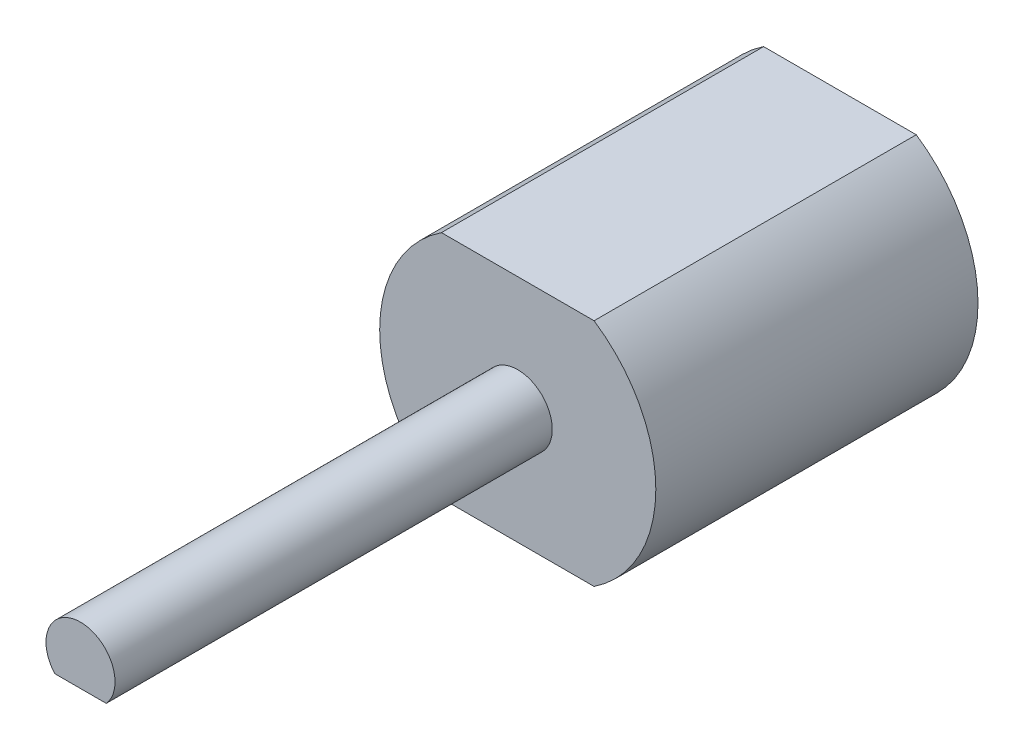
ISO-10303-21;
HEADER;
FILE_DESCRIPTION(('STEP AP214'),'2;1');
FILE_NAME('part.step','',(''),(''),'','','');
FILE_SCHEMA(('AUTOMOTIVE_DESIGN { 1 0 10303 214 1 1 1 1 }'));
ENDSEC;
DATA;
#1=APPLICATION_CONTEXT('core data for automotive mechanical design processes');
#2=APPLICATION_PROTOCOL_DEFINITION('international standard','automotive_design',2000,#1);
#3=PRODUCT_CONTEXT('',#1,'mechanical');
#4=PRODUCT('Part','Part','',(#3));
#5=PRODUCT_RELATED_PRODUCT_CATEGORY('part','',(#4));
#6=PRODUCT_DEFINITION_FORMATION('','',#4);
#7=PRODUCT_DEFINITION_CONTEXT('part definition',#1,'design');
#8=PRODUCT_DEFINITION('design','',#6,#7);
#9=PRODUCT_DEFINITION_SHAPE('','',#8);
#10=(LENGTH_UNIT() NAMED_UNIT(*) SI_UNIT(.MILLI.,.METRE.));
#11=(NAMED_UNIT(*) PLANE_ANGLE_UNIT() SI_UNIT($,.RADIAN.));
#12=(NAMED_UNIT(*) SI_UNIT($,.STERADIAN.) SOLID_ANGLE_UNIT());
#13=UNCERTAINTY_MEASURE_WITH_UNIT(LENGTH_MEASURE(1.E-05),#10,'distance_accuracy_value','');
#14=(GEOMETRIC_REPRESENTATION_CONTEXT(3) GLOBAL_UNCERTAINTY_ASSIGNED_CONTEXT((#13)) GLOBAL_UNIT_ASSIGNED_CONTEXT((#10,
#11,#12)) REPRESENTATION_CONTEXT('',''));
#15=CARTESIAN_POINT('',(0.,0.,0.));
#16=DIRECTION('',(0.,0.,1.));
#17=DIRECTION('',(1.,0.,0.));
#18=AXIS2_PLACEMENT_3D('',#15,#16,#17);
#19=CARTESIAN_POINT('',(0.,0.,25.));
#20=DIRECTION('',(0.,0.,1.));
#21=DIRECTION('',(1.,0.,0.));
#22=AXIS2_PLACEMENT_3D('',#19,#20,#21);
#23=PLANE('',#22);
#24=CARTESIAN_POINT('',(0.,0.,25.));
#25=DIRECTION('',(0.,0.,-1.));
#26=DIRECTION('',(-1.,0.,0.));
#27=AXIS2_PLACEMENT_3D('',#24,#25,#26);
#28=CIRCLE('',#27,1.5);
#29=CARTESIAN_POINT('',(-1.11803398874989,-1.,25.));
#30=VERTEX_POINT('',#29);
#31=CARTESIAN_POINT('',(1.11803398874989,-1.,25.));
#32=VERTEX_POINT('',#31);
#33=EDGE_CURVE('E23',#30,#32,#28,.F.);
#34=ORIENTED_EDGE('',*,*,#33,.T.);
#35=DIRECTION('',(1.,0.,0.));
#36=VECTOR('',#35,1.);
#37=CARTESIAN_POINT('',(0.,-1.,25.));
#38=LINE('',#37,#36);
#39=EDGE_CURVE('E94',#32,#30,#38,.F.);
#40=ORIENTED_EDGE('',*,*,#39,.T.);
#41=EDGE_LOOP('',(#34,#40));
#42=FACE_BOUND('',#41,.T.);
#43=ADVANCED_FACE('F19',(#42),#23,.T.);
#44=CARTESIAN_POINT('',(0.,-1.,25.));
#45=DIRECTION('',(0.,1.,0.));
#46=DIRECTION('',(0.,0.,1.));
#47=AXIS2_PLACEMENT_3D('',#44,#45,#46);
#48=PLANE('',#47);
#49=DIRECTION('',(0.,0.,-1.));
#50=VECTOR('',#49,1.);
#51=CARTESIAN_POINT('',(-1.11803398874989,-1.,14.));
#52=LINE('',#51,#50);
#53=CARTESIAN_POINT('',(-1.11803398874989,-1.,33.));
#54=VERTEX_POINT('',#53);
#55=EDGE_CURVE('E90',#30,#54,#52,.F.);
#56=ORIENTED_EDGE('',*,*,#55,.F.);
#57=ORIENTED_EDGE('',*,*,#39,.F.);
#58=DIRECTION('',(0.,0.,-1.));
#59=VECTOR('',#58,1.);
#60=CARTESIAN_POINT('',(1.11803398874989,-1.,14.));
#61=LINE('',#60,#59);
#62=CARTESIAN_POINT('',(1.11803398874989,-1.,33.));
#63=VERTEX_POINT('',#62);
#64=EDGE_CURVE('E92',#63,#32,#61,.T.);
#65=ORIENTED_EDGE('',*,*,#64,.F.);
#66=DIRECTION('',(1.,0.,0.));
#67=VECTOR('',#66,1.);
#68=CARTESIAN_POINT('',(1.5,-1.,33.));
#69=LINE('',#68,#67);
#70=EDGE_CURVE('E97',#63,#54,#69,.F.);
#71=ORIENTED_EDGE('',*,*,#70,.T.);
#72=EDGE_LOOP('',(#56,#57,#65,#71));
#73=FACE_BOUND('',#72,.T.);
#74=ADVANCED_FACE('F99',(#73),#48,.F.);
#75=CARTESIAN_POINT('',(1.5,0.,33.));
#76=DIRECTION('',(0.,0.,-1.));
#77=DIRECTION('',(0.,1.,0.));
#78=AXIS2_PLACEMENT_3D('',#75,#76,#77);
#79=PLANE('',#78);
#80=ORIENTED_EDGE('',*,*,#70,.F.);
#81=CARTESIAN_POINT('',(0.,0.,33.));
#82=DIRECTION('',(0.,0.,-1.));
#83=DIRECTION('',(-1.,0.,0.));
#84=AXIS2_PLACEMENT_3D('',#81,#82,#83);
#85=CIRCLE('',#84,1.5);
#86=EDGE_CURVE('E103',#54,#63,#85,.T.);
#87=ORIENTED_EDGE('',*,*,#86,.F.);
#88=EDGE_LOOP('',(#80,#87));
#89=FACE_BOUND('',#88,.T.);
#90=ADVANCED_FACE('F217',(#89),#79,.F.);
#91=CARTESIAN_POINT('',(0.,0.,14.));
#92=DIRECTION('',(0.,0.,-1.));
#93=DIRECTION('',(-1.,0.,0.));
#94=AXIS2_PLACEMENT_3D('',#91,#92,#93);
#95=CYLINDRICAL_SURFACE('',#94,1.5);
#96=CARTESIAN_POINT('',(0.,0.,14.));
#97=DIRECTION('',(0.,0.,-1.));
#98=DIRECTION('',(-1.,0.,0.));
#99=AXIS2_PLACEMENT_3D('',#96,#97,#98);
#100=CIRCLE('',#99,1.5);
#101=CARTESIAN_POINT('',(-1.5,0.,14.));
#102=VERTEX_POINT('',#101);
#103=EDGE_CURVE('E145',#102,#102,#100,.F.);
#104=ORIENTED_EDGE('',*,*,#103,.T.);
#105=EDGE_LOOP('',(#104));
#106=FACE_BOUND('',#105,.T.);
#107=ORIENTED_EDGE('',*,*,#86,.T.);
#108=ORIENTED_EDGE('',*,*,#64,.T.);
#109=ORIENTED_EDGE('',*,*,#33,.F.);
#110=ORIENTED_EDGE('',*,*,#55,.T.);
#111=EDGE_LOOP('',(#107,#108,#109,#110));
#112=FACE_BOUND('',#111,.T.);
#113=ADVANCED_FACE('F88',(#106,#112),#95,.T.);
#114=CARTESIAN_POINT('',(0.,0.,0.));
#115=DIRECTION('',(0.,0.,-1.));
#116=DIRECTION('',(0.,1.,0.));
#117=AXIS2_PLACEMENT_3D('',#114,#115,#116);
#118=CYLINDRICAL_SURFACE('',#117,6.);
#119=CARTESIAN_POINT('',(0.,0.,0.));
#120=DIRECTION('',(0.,0.,-1.));
#121=DIRECTION('',(0.,1.,0.));
#122=AXIS2_PLACEMENT_3D('',#119,#120,#121);
#123=CIRCLE('',#122,6.);
#124=CARTESIAN_POINT('',(3.31662479035692,4.999999999999,0.));
#125=VERTEX_POINT('',#124);
#126=CARTESIAN_POINT('',(3.31662479035675,-4.999999999999,0.));
#127=VERTEX_POINT('',#126);
#128=EDGE_CURVE('E124',#125,#127,#123,.T.);
#129=ORIENTED_EDGE('',*,*,#128,.F.);
#130=DIRECTION('',(0.,0.,-1.));
#131=VECTOR('',#130,1.);
#132=CARTESIAN_POINT('',(3.31662479035694,4.999999999999,0.));
#133=LINE('',#132,#131);
#134=CARTESIAN_POINT('',(3.31662479035692,4.999999999999,14.));
#135=VERTEX_POINT('',#134);
#136=EDGE_CURVE('E143',#125,#135,#133,.F.);
#137=ORIENTED_EDGE('',*,*,#136,.T.);
#138=CARTESIAN_POINT('',(0.,0.,14.));
#139=DIRECTION('',(0.,0.,-1.));
#140=DIRECTION('',(0.,1.,0.));
#141=AXIS2_PLACEMENT_3D('',#138,#139,#140);
#142=CIRCLE('',#141,6.);
#143=CARTESIAN_POINT('',(3.31662479035675,-4.999999999999,14.));
#144=VERTEX_POINT('',#143);
#145=EDGE_CURVE('E109',#135,#144,#142,.T.);
#146=ORIENTED_EDGE('',*,*,#145,.T.);
#147=DIRECTION('',(0.,0.,1.));
#148=VECTOR('',#147,1.);
#149=CARTESIAN_POINT('',(3.31662479035659,-4.999999999999,0.));
#150=LINE('',#149,#148);
#151=EDGE_CURVE('E123',#144,#127,#150,.F.);
#152=ORIENTED_EDGE('',*,*,#151,.T.);
#153=EDGE_LOOP('',(#129,#137,#146,#152));
#154=FACE_BOUND('',#153,.T.);
#155=ADVANCED_FACE('F174',(#154),#118,.T.);
#156=CARTESIAN_POINT('',(-3.316624790358,-4.999999999999,14.));
#157=DIRECTION('',(0.,0.,-1.));
#158=DIRECTION('',(0.,1.,0.));
#159=AXIS2_PLACEMENT_3D('',#156,#157,#158);
#160=PLANE('',#159);
#161=ORIENTED_EDGE('',*,*,#103,.F.);
#162=EDGE_LOOP('',(#161));
#163=FACE_BOUND('',#162,.T.);
#164=CARTESIAN_POINT('',(0.,0.,14.));
#165=DIRECTION('',(0.,0.,-1.));
#166=DIRECTION('',(0.,1.,0.));
#167=AXIS2_PLACEMENT_3D('',#164,#165,#166);
#168=CIRCLE('',#167,6.);
#169=CARTESIAN_POINT('',(-3.3166247903571,-4.99999999999887,14.));
#170=VERTEX_POINT('',#169);
#171=CARTESIAN_POINT('',(-3.3166247903562,4.99999999999947,14.));
#172=VERTEX_POINT('',#171);
#173=EDGE_CURVE('E118',#170,#172,#168,.T.);
#174=ORIENTED_EDGE('',*,*,#173,.F.);
#175=DIRECTION('',(1.,0.,0.));
#176=VECTOR('',#175,1.);
#177=CARTESIAN_POINT('',(-3.316624790358,-4.999999999999,14.));
#178=LINE('',#177,#176);
#179=EDGE_CURVE('E133',#170,#144,#178,.T.);
#180=ORIENTED_EDGE('',*,*,#179,.T.);
#181=ORIENTED_EDGE('',*,*,#145,.F.);
#182=DIRECTION('',(1.,0.,0.));
#183=VECTOR('',#182,1.);
#184=CARTESIAN_POINT('',(3.316624790357,4.999999999999,14.));
#185=LINE('',#184,#183);
#186=EDGE_CURVE('E139',#135,#172,#185,.F.);
#187=ORIENTED_EDGE('',*,*,#186,.T.);
#188=EDGE_LOOP('',(#174,#180,#181,#187));
#189=FACE_BOUND('',#188,.T.);
#190=ADVANCED_FACE('F185',(#163,#189),#160,.F.);
#191=CARTESIAN_POINT('',(3.316624790357,4.999999999999,0.));
#192=DIRECTION('',(0.,-1.,0.));
#193=DIRECTION('',(0.,0.,-1.));
#194=AXIS2_PLACEMENT_3D('',#191,#192,#193);
#195=PLANE('',#194);
#196=ORIENTED_EDGE('',*,*,#186,.F.);
#197=ORIENTED_EDGE('',*,*,#136,.F.);
#198=DIRECTION('',(1.,0.,0.));
#199=VECTOR('',#198,1.);
#200=CARTESIAN_POINT('',(-3.316624790358,4.999999999999,0.));
#201=LINE('',#200,#199);
#202=CARTESIAN_POINT('',(-3.3166247903562,4.99999999999947,0.));
#203=VERTEX_POINT('',#202);
#204=EDGE_CURVE('E163',#203,#125,#201,.T.);
#205=ORIENTED_EDGE('',*,*,#204,.F.);
#206=DIRECTION('',(0.,0.,-1.));
#207=VECTOR('',#206,1.);
#208=CARTESIAN_POINT('',(-3.3166247903555,4.99999999999993,0.));
#209=LINE('',#208,#207);
#210=EDGE_CURVE('E117',#172,#203,#209,.T.);
#211=ORIENTED_EDGE('',*,*,#210,.F.);
#212=EDGE_LOOP('',(#196,#197,#205,#211));
#213=FACE_BOUND('',#212,.T.);
#214=ADVANCED_FACE('F183',(#213),#195,.F.);
#215=CARTESIAN_POINT('',(-3.316624790358,-4.999999999999,0.));
#216=DIRECTION('',(0.,0.,-1.));
#217=DIRECTION('',(0.,1.,0.));
#218=AXIS2_PLACEMENT_3D('',#215,#216,#217);
#219=PLANE('',#218);
#220=CARTESIAN_POINT('',(0.,0.,0.));
#221=DIRECTION('',(0.,0.,-1.));
#222=DIRECTION('',(0.,1.,0.));
#223=AXIS2_PLACEMENT_3D('',#220,#221,#222);
#224=CIRCLE('',#223,6.);
#225=CARTESIAN_POINT('',(-3.3166247903571,-4.99999999999888,0.));
#226=VERTEX_POINT('',#225);
#227=EDGE_CURVE('E30',#203,#226,#224,.F.);
#228=ORIENTED_EDGE('',*,*,#227,.F.);
#229=ORIENTED_EDGE('',*,*,#204,.T.);
#230=ORIENTED_EDGE('',*,*,#128,.T.);
#231=DIRECTION('',(1.,0.,0.));
#232=VECTOR('',#231,1.);
#233=CARTESIAN_POINT('',(-3.316624790358,-4.999999999999,0.));
#234=LINE('',#233,#232);
#235=EDGE_CURVE('E42',#127,#226,#234,.F.);
#236=ORIENTED_EDGE('',*,*,#235,.T.);
#237=EDGE_LOOP('',(#228,#229,#230,#236));
#238=FACE_BOUND('',#237,.T.);
#239=ADVANCED_FACE('F172',(#238),#219,.T.);
#240=CARTESIAN_POINT('',(-3.316624790358,-4.999999999999,0.));
#241=DIRECTION('',(0.,1.,0.));
#242=DIRECTION('',(0.,0.,1.));
#243=AXIS2_PLACEMENT_3D('',#240,#241,#242);
#244=PLANE('',#243);
#245=ORIENTED_EDGE('',*,*,#179,.F.);
#246=DIRECTION('',(0.,0.,-1.));
#247=VECTOR('',#246,1.);
#248=CARTESIAN_POINT('',(-3.31662479035728,-4.99999999999875,0.));
#249=LINE('',#248,#247);
#250=EDGE_CURVE('E12',#226,#170,#249,.F.);
#251=ORIENTED_EDGE('',*,*,#250,.F.);
#252=ORIENTED_EDGE('',*,*,#235,.F.);
#253=ORIENTED_EDGE('',*,*,#151,.F.);
#254=EDGE_LOOP('',(#245,#251,#252,#253));
#255=FACE_BOUND('',#254,.T.);
#256=ADVANCED_FACE('F177',(#255),#244,.F.);
#257=CARTESIAN_POINT('',(0.,0.,0.));
#258=DIRECTION('',(0.,0.,-1.));
#259=DIRECTION('',(0.,1.,0.));
#260=AXIS2_PLACEMENT_3D('',#257,#258,#259);
#261=CYLINDRICAL_SURFACE('',#260,6.);
#262=ORIENTED_EDGE('',*,*,#227,.T.);
#263=ORIENTED_EDGE('',*,*,#250,.T.);
#264=ORIENTED_EDGE('',*,*,#173,.T.);
#265=ORIENTED_EDGE('',*,*,#210,.T.);
#266=EDGE_LOOP('',(#262,#263,#264,#265));
#267=FACE_BOUND('',#266,.T.);
#268=ADVANCED_FACE('F179',(#267),#261,.T.);
#269=CLOSED_SHELL('',(#43,#74,#90,#113,#155,#190,#214,#239,#256,#268));
#270=MANIFOLD_SOLID_BREP('B1',#269);
#271=ADVANCED_BREP_SHAPE_REPRESENTATION('',(#18,#270),#14);
#272=SHAPE_DEFINITION_REPRESENTATION(#9,#271);
ENDSEC;
END-ISO-10303-21;
